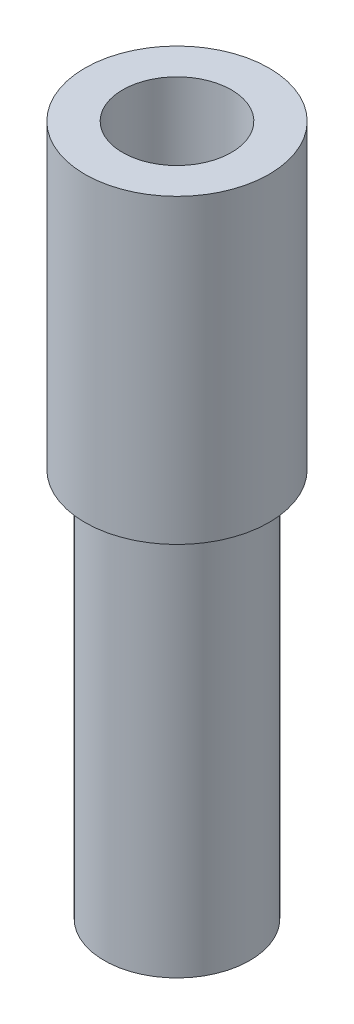
ISO-10303-21;
HEADER;
FILE_DESCRIPTION(('STEP AP214'),'2;1');
FILE_NAME('part.step','',(''),(''),'','','');
FILE_SCHEMA(('AUTOMOTIVE_DESIGN { 1 0 10303 214 1 1 1 1 }'));
ENDSEC;
DATA;
#1=APPLICATION_CONTEXT('core data for automotive mechanical design processes');
#2=APPLICATION_PROTOCOL_DEFINITION('international standard','automotive_design',2000,#1);
#3=PRODUCT_CONTEXT('',#1,'mechanical');
#4=PRODUCT('Part','Part','',(#3));
#5=PRODUCT_RELATED_PRODUCT_CATEGORY('part','',(#4));
#6=PRODUCT_DEFINITION_FORMATION('','',#4);
#7=PRODUCT_DEFINITION_CONTEXT('part definition',#1,'design');
#8=PRODUCT_DEFINITION('design','',#6,#7);
#9=PRODUCT_DEFINITION_SHAPE('','',#8);
#10=(LENGTH_UNIT() NAMED_UNIT(*) SI_UNIT(.MILLI.,.METRE.));
#11=(NAMED_UNIT(*) PLANE_ANGLE_UNIT() SI_UNIT($,.RADIAN.));
#12=(NAMED_UNIT(*) SI_UNIT($,.STERADIAN.) SOLID_ANGLE_UNIT());
#13=UNCERTAINTY_MEASURE_WITH_UNIT(LENGTH_MEASURE(1.E-05),#10,'distance_accuracy_value','');
#14=(GEOMETRIC_REPRESENTATION_CONTEXT(3) GLOBAL_UNCERTAINTY_ASSIGNED_CONTEXT((#13)) GLOBAL_UNIT_ASSIGNED_CONTEXT((#10,
#11,#12)) REPRESENTATION_CONTEXT('',''));
#15=CARTESIAN_POINT('',(0.,0.,0.));
#16=DIRECTION('',(0.,0.,1.));
#17=DIRECTION('',(1.,0.,0.));
#18=AXIS2_PLACEMENT_3D('',#15,#16,#17);
#19=CARTESIAN_POINT('',(0.,0.,0.));
#20=DIRECTION('',(0.,-1.,0.));
#21=DIRECTION('',(0.,0.,-1.));
#22=AXIS2_PLACEMENT_3D('',#19,#20,#21);
#23=CYLINDRICAL_SURFACE('',#22,5.90450796463787);
#24=CARTESIAN_POINT('',(0.,0.,0.));
#25=DIRECTION('',(0.,-1.,0.));
#26=DIRECTION('',(0.,0.,-1.));
#27=AXIS2_PLACEMENT_3D('',#24,#25,#26);
#28=CIRCLE('',#27,5.90450796463787);
#29=CARTESIAN_POINT('',(0.,0.,-5.90450796463787));
#30=VERTEX_POINT('',#29);
#31=EDGE_CURVE('E10',#30,#30,#28,.T.);
#32=ORIENTED_EDGE('',*,*,#31,.T.);
#33=EDGE_LOOP('',(#32));
#34=FACE_BOUND('',#33,.T.);
#35=CARTESIAN_POINT('',(0.,4.96872985888759,0.));
#36=DIRECTION('',(0.,-1.,0.));
#37=DIRECTION('',(0.,0.,-1.));
#38=AXIS2_PLACEMENT_3D('',#35,#36,#37);
#39=CIRCLE('',#38,5.90450796463787);
#40=CARTESIAN_POINT('',(0.,4.96872985888759,-5.90450796463787));
#41=VERTEX_POINT('',#40);
#42=EDGE_CURVE('E65',#41,#41,#39,.T.);
#43=ORIENTED_EDGE('',*,*,#42,.F.);
#44=EDGE_LOOP('',(#43));
#45=FACE_BOUND('',#44,.T.);
#46=ADVANCED_FACE('F31',(#34,#45),#23,.F.);
#47=CARTESIAN_POINT('',(0.,0.,-5.90450796463787));
#48=DIRECTION('',(0.,-1.,0.));
#49=DIRECTION('',(0.,0.,-1.));
#50=AXIS2_PLACEMENT_3D('',#47,#48,#49);
#51=PLANE('',#50);
#52=CARTESIAN_POINT('',(0.,0.,0.));
#53=DIRECTION('',(0.,-1.,0.));
#54=DIRECTION('',(0.,0.,-1.));
#55=AXIS2_PLACEMENT_3D('',#52,#53,#54);
#56=CIRCLE('',#55,7.90450796463787);
#57=CARTESIAN_POINT('',(0.,0.,-7.90450796463787));
#58=VERTEX_POINT('',#57);
#59=EDGE_CURVE('E37',#58,#58,#56,.T.);
#60=ORIENTED_EDGE('',*,*,#59,.T.);
#61=EDGE_LOOP('',(#60));
#62=FACE_BOUND('',#61,.T.);
#63=ORIENTED_EDGE('',*,*,#31,.F.);
#64=EDGE_LOOP('',(#63));
#65=FACE_BOUND('',#64,.T.);
#66=ADVANCED_FACE('F73',(#62,#65),#51,.T.);
#67=CARTESIAN_POINT('',(0.,0.,0.));
#68=DIRECTION('',(0.,-1.,0.));
#69=DIRECTION('',(0.,0.,-1.));
#70=AXIS2_PLACEMENT_3D('',#67,#68,#69);
#71=CYLINDRICAL_SURFACE('',#70,7.90450796463787);
#72=CARTESIAN_POINT('',(0.,42.2543703667692,0.));
#73=DIRECTION('',(0.,-1.,0.));
#74=DIRECTION('',(0.,0.,-1.));
#75=AXIS2_PLACEMENT_3D('',#72,#73,#74);
#76=CIRCLE('',#75,7.90450796463787);
#77=CARTESIAN_POINT('',(0.,42.2543703667692,-7.90450796463787));
#78=VERTEX_POINT('',#77);
#79=EDGE_CURVE('E41',#78,#78,#76,.T.);
#80=ORIENTED_EDGE('',*,*,#79,.T.);
#81=EDGE_LOOP('',(#80));
#82=FACE_BOUND('',#81,.T.);
#83=ORIENTED_EDGE('',*,*,#59,.F.);
#84=EDGE_LOOP('',(#83));
#85=FACE_BOUND('',#84,.T.);
#86=ADVANCED_FACE('F77',(#82,#85),#71,.T.);
#87=CARTESIAN_POINT('',(0.,42.2543703667692,-7.90450796463787));
#88=DIRECTION('',(0.,-1.,0.));
#89=DIRECTION('',(0.,0.,-1.));
#90=AXIS2_PLACEMENT_3D('',#87,#88,#89);
#91=PLANE('',#90);
#92=CARTESIAN_POINT('',(0.,42.2543703667692,0.));
#93=DIRECTION('',(0.,-1.,0.));
#94=DIRECTION('',(0.,0.,-1.));
#95=AXIS2_PLACEMENT_3D('',#92,#93,#94);
#96=CIRCLE('',#95,10.);
#97=CARTESIAN_POINT('',(0.,42.2543703667692,-10.));
#98=VERTEX_POINT('',#97);
#99=EDGE_CURVE('E45',#98,#98,#96,.T.);
#100=ORIENTED_EDGE('',*,*,#99,.T.);
#101=EDGE_LOOP('',(#100));
#102=FACE_BOUND('',#101,.T.);
#103=ORIENTED_EDGE('',*,*,#79,.F.);
#104=EDGE_LOOP('',(#103));
#105=FACE_BOUND('',#104,.T.);
#106=ADVANCED_FACE('F81',(#102,#105),#91,.T.);
#107=CARTESIAN_POINT('',(0.,0.,0.));
#108=DIRECTION('',(0.,-1.,0.));
#109=DIRECTION('',(0.,0.,-1.));
#110=AXIS2_PLACEMENT_3D('',#107,#108,#109);
#111=CYLINDRICAL_SURFACE('',#110,10.);
#112=CARTESIAN_POINT('',(0.,75.,0.));
#113=DIRECTION('',(0.,-1.,0.));
#114=DIRECTION('',(0.,0.,-1.));
#115=AXIS2_PLACEMENT_3D('',#112,#113,#114);
#116=CIRCLE('',#115,10.);
#117=CARTESIAN_POINT('',(0.,75.,-10.));
#118=VERTEX_POINT('',#117);
#119=EDGE_CURVE('E50',#118,#118,#116,.T.);
#120=ORIENTED_EDGE('',*,*,#119,.T.);
#121=EDGE_LOOP('',(#120));
#122=FACE_BOUND('',#121,.T.);
#123=ORIENTED_EDGE('',*,*,#99,.F.);
#124=EDGE_LOOP('',(#123));
#125=FACE_BOUND('',#124,.T.);
#126=ADVANCED_FACE('F88',(#122,#125),#111,.T.);
#127=CARTESIAN_POINT('',(0.,75.,-10.));
#128=DIRECTION('',(0.,1.,0.));
#129=DIRECTION('',(0.,0.,1.));
#130=AXIS2_PLACEMENT_3D('',#127,#128,#129);
#131=PLANE('',#130);
#132=CARTESIAN_POINT('',(0.,75.,0.));
#133=DIRECTION('',(0.,-1.,0.));
#134=DIRECTION('',(0.,0.,-1.));
#135=AXIS2_PLACEMENT_3D('',#132,#133,#134);
#136=CIRCLE('',#135,5.90450796463786);
#137=CARTESIAN_POINT('',(0.,75.,-5.90450796463786));
#138=VERTEX_POINT('',#137);
#139=EDGE_CURVE('E53',#138,#138,#136,.T.);
#140=ORIENTED_EDGE('',*,*,#139,.T.);
#141=EDGE_LOOP('',(#140));
#142=FACE_BOUND('',#141,.T.);
#143=ORIENTED_EDGE('',*,*,#119,.F.);
#144=EDGE_LOOP('',(#143));
#145=FACE_BOUND('',#144,.T.);
#146=ADVANCED_FACE('F92',(#142,#145),#131,.T.);
#147=CARTESIAN_POINT('',(0.,0.,0.));
#148=DIRECTION('',(0.,-1.,0.));
#149=DIRECTION('',(0.,0.,-1.));
#150=AXIS2_PLACEMENT_3D('',#147,#148,#149);
#151=CYLINDRICAL_SURFACE('',#150,5.90450796463786);
#152=CARTESIAN_POINT('',(0.,6.76239194543642,0.));
#153=DIRECTION('',(0.,-1.,0.));
#154=DIRECTION('',(0.,0.,-1.));
#155=AXIS2_PLACEMENT_3D('',#152,#153,#154);
#156=CIRCLE('',#155,5.90450796463787);
#157=CARTESIAN_POINT('',(0.,6.76239194543642,-5.90450796463787));
#158=VERTEX_POINT('',#157);
#159=EDGE_CURVE('E56',#158,#158,#156,.T.);
#160=ORIENTED_EDGE('',*,*,#159,.T.);
#161=EDGE_LOOP('',(#160));
#162=FACE_BOUND('',#161,.T.);
#163=ORIENTED_EDGE('',*,*,#139,.F.);
#164=EDGE_LOOP('',(#163));
#165=FACE_BOUND('',#164,.T.);
#166=ADVANCED_FACE('F96',(#162,#165),#151,.F.);
#167=CARTESIAN_POINT('',(0.,6.76239194543642,-5.90450796463787));
#168=DIRECTION('',(0.,1.,0.));
#169=DIRECTION('',(0.,0.,1.));
#170=AXIS2_PLACEMENT_3D('',#167,#168,#169);
#171=PLANE('',#170);
#172=CARTESIAN_POINT('',(0.,6.76239194543642,0.));
#173=DIRECTION('',(0.,-1.,0.));
#174=DIRECTION('',(0.,0.,-1.));
#175=AXIS2_PLACEMENT_3D('',#172,#173,#174);
#176=CIRCLE('',#175,4.);
#177=CARTESIAN_POINT('',(0.,6.76239194543642,-4.));
#178=VERTEX_POINT('',#177);
#179=EDGE_CURVE('E59',#178,#178,#176,.T.);
#180=ORIENTED_EDGE('',*,*,#179,.T.);
#181=EDGE_LOOP('',(#180));
#182=FACE_BOUND('',#181,.T.);
#183=ORIENTED_EDGE('',*,*,#159,.F.);
#184=EDGE_LOOP('',(#183));
#185=FACE_BOUND('',#184,.T.);
#186=ADVANCED_FACE('F100',(#182,#185),#171,.T.);
#187=CARTESIAN_POINT('',(0.,0.,0.));
#188=DIRECTION('',(0.,-1.,0.));
#189=DIRECTION('',(0.,0.,-1.));
#190=AXIS2_PLACEMENT_3D('',#187,#188,#189);
#191=CYLINDRICAL_SURFACE('',#190,4.);
#192=CARTESIAN_POINT('',(0.,4.96872985888759,0.));
#193=DIRECTION('',(0.,-1.,0.));
#194=DIRECTION('',(0.,0.,-1.));
#195=AXIS2_PLACEMENT_3D('',#192,#193,#194);
#196=CIRCLE('',#195,4.);
#197=CARTESIAN_POINT('',(0.,4.96872985888759,-4.));
#198=VERTEX_POINT('',#197);
#199=EDGE_CURVE('E62',#198,#198,#196,.T.);
#200=ORIENTED_EDGE('',*,*,#199,.T.);
#201=EDGE_LOOP('',(#200));
#202=FACE_BOUND('',#201,.T.);
#203=ORIENTED_EDGE('',*,*,#179,.F.);
#204=EDGE_LOOP('',(#203));
#205=FACE_BOUND('',#204,.T.);
#206=ADVANCED_FACE('F104',(#202,#205),#191,.F.);
#207=CARTESIAN_POINT('',(0.,4.96872985888759,-4.));
#208=DIRECTION('',(0.,-1.,0.));
#209=DIRECTION('',(0.,0.,-1.));
#210=AXIS2_PLACEMENT_3D('',#207,#208,#209);
#211=PLANE('',#210);
#212=ORIENTED_EDGE('',*,*,#42,.T.);
#213=EDGE_LOOP('',(#212));
#214=FACE_BOUND('',#213,.T.);
#215=ORIENTED_EDGE('',*,*,#199,.F.);
#216=EDGE_LOOP('',(#215));
#217=FACE_BOUND('',#216,.T.);
#218=ADVANCED_FACE('F69',(#214,#217),#211,.T.);
#219=CLOSED_SHELL('',(#46,#66,#86,#106,#126,#146,#166,#186,#206,#218));
#220=MANIFOLD_SOLID_BREP('B2',#219);
#221=ADVANCED_BREP_SHAPE_REPRESENTATION('',(#18,#220),#14);
#222=SHAPE_DEFINITION_REPRESENTATION(#9,#221);
ENDSEC;
END-ISO-10303-21;
